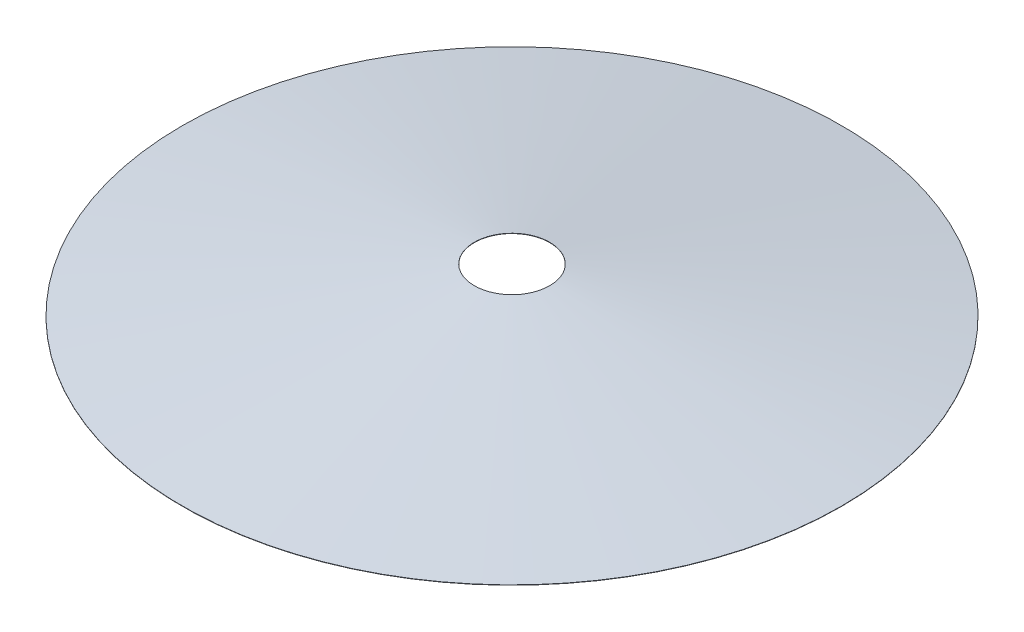
ISO-10303-21;
HEADER;
FILE_DESCRIPTION(('STEP AP214'),'2;1');
FILE_NAME('part.step','',(''),(''),'','','');
FILE_SCHEMA(('AUTOMOTIVE_DESIGN { 1 0 10303 214 1 1 1 1 }'));
ENDSEC;
DATA;
#1=APPLICATION_CONTEXT('core data for automotive mechanical design processes');
#2=APPLICATION_PROTOCOL_DEFINITION('international standard','automotive_design',2000,#1);
#3=PRODUCT_CONTEXT('',#1,'mechanical');
#4=PRODUCT('Part','Part','',(#3));
#5=PRODUCT_RELATED_PRODUCT_CATEGORY('part','',(#4));
#6=PRODUCT_DEFINITION_FORMATION('','',#4);
#7=PRODUCT_DEFINITION_CONTEXT('part definition',#1,'design');
#8=PRODUCT_DEFINITION('design','',#6,#7);
#9=PRODUCT_DEFINITION_SHAPE('','',#8);
#10=(LENGTH_UNIT() NAMED_UNIT(*) SI_UNIT(.MILLI.,.METRE.));
#11=(NAMED_UNIT(*) PLANE_ANGLE_UNIT() SI_UNIT($,.RADIAN.));
#12=(NAMED_UNIT(*) SI_UNIT($,.STERADIAN.) SOLID_ANGLE_UNIT());
#13=UNCERTAINTY_MEASURE_WITH_UNIT(LENGTH_MEASURE(1.E-05),#10,'distance_accuracy_value','');
#14=(GEOMETRIC_REPRESENTATION_CONTEXT(3) GLOBAL_UNCERTAINTY_ASSIGNED_CONTEXT((#13)) GLOBAL_UNIT_ASSIGNED_CONTEXT((#10,
#11,#12)) REPRESENTATION_CONTEXT('',''));
#15=CARTESIAN_POINT('',(0.,0.,0.));
#16=DIRECTION('',(0.,0.,1.));
#17=DIRECTION('',(1.,0.,0.));
#18=AXIS2_PLACEMENT_3D('',#15,#16,#17);
#19=CARTESIAN_POINT('',(0.,800.,0.));
#20=DIRECTION('',(0.,-1.,0.));
#21=DIRECTION('',(1.,0.,0.));
#22=AXIS2_PLACEMENT_3D('',#19,#20,#21);
#23=CONICAL_SURFACE('',#22,500.,1.41814699839963);
#24=CARTESIAN_POINT('',(0.,204.,0.));
#25=DIRECTION('',(0.,1.,0.));
#26=DIRECTION('',(-1.,0.,0.));
#27=AXIS2_PLACEMENT_3D('',#24,#25,#26);
#28=CIRCLE('',#27,4374.);
#29=CARTESIAN_POINT('',(4374.,204.,0.));
#30=VERTEX_POINT('',#29);
#31=EDGE_CURVE('E10',#30,#30,#28,.T.);
#32=CARTESIAN_POINT('',(0.,800.,0.));
#33=DIRECTION('',(0.,1.,0.));
#34=DIRECTION('',(-1.,0.,0.));
#35=AXIS2_PLACEMENT_3D('',#32,#33,#34);
#36=CIRCLE('',#35,500.);
#37=CARTESIAN_POINT('',(500.,800.,0.));
#38=VERTEX_POINT('',#37);
#39=EDGE_CURVE('E51',#38,#38,#36,.T.);
#40=CARTESIAN_POINT('',(4374.,204.,0.));
#41=CARTESIAN_POINT('',(4333.64583333333,210.208333333334,0.));
#42=CARTESIAN_POINT('',(4293.29166666667,216.416666666667,0.));
#43=CARTESIAN_POINT('',(4212.58333333333,228.833333333334,0.));
#44=CARTESIAN_POINT('',(4172.22916666667,235.041666666667,0.));
#45=CARTESIAN_POINT('',(4091.52083333333,247.458333333334,0.));
#46=CARTESIAN_POINT('',(4051.16666666667,253.666666666667,0.));
#47=CARTESIAN_POINT('',(3970.45833333333,266.083333333334,0.));
#48=CARTESIAN_POINT('',(3930.10416666667,272.291666666667,0.));
#49=CARTESIAN_POINT('',(3849.39583333333,284.708333333334,0.));
#50=CARTESIAN_POINT('',(3809.04166666667,290.916666666667,0.));
#51=CARTESIAN_POINT('',(3728.33333333333,303.333333333334,0.));
#52=CARTESIAN_POINT('',(3687.97916666667,309.541666666667,0.));
#53=CARTESIAN_POINT('',(3607.27083333333,321.958333333334,0.));
#54=CARTESIAN_POINT('',(3566.91666666667,328.166666666667,0.));
#55=CARTESIAN_POINT('',(3486.20833333333,340.583333333334,0.));
#56=CARTESIAN_POINT('',(3445.85416666667,346.791666666667,0.));
#57=CARTESIAN_POINT('',(3365.14583333333,359.208333333334,0.));
#58=CARTESIAN_POINT('',(3324.79166666667,365.416666666667,0.));
#59=CARTESIAN_POINT('',(3244.08333333333,377.833333333334,0.));
#60=CARTESIAN_POINT('',(3203.72916666667,384.041666666667,0.));
#61=CARTESIAN_POINT('',(3123.02083333333,396.458333333334,0.));
#62=CARTESIAN_POINT('',(3082.66666666667,402.666666666667,0.));
#63=CARTESIAN_POINT('',(3001.95833333333,415.083333333334,0.));
#64=CARTESIAN_POINT('',(2961.60416666667,421.291666666667,0.));
#65=CARTESIAN_POINT('',(2880.89583333333,433.708333333334,0.));
#66=CARTESIAN_POINT('',(2840.54166666667,439.916666666667,0.));
#67=CARTESIAN_POINT('',(2759.83333333333,452.333333333334,0.));
#68=CARTESIAN_POINT('',(2719.47916666667,458.541666666667,0.));
#69=CARTESIAN_POINT('',(2638.77083333333,470.958333333334,0.));
#70=CARTESIAN_POINT('',(2598.41666666667,477.166666666667,0.));
#71=CARTESIAN_POINT('',(2517.70833333333,489.583333333334,0.));
#72=CARTESIAN_POINT('',(2477.35416666667,495.791666666667,0.));
#73=CARTESIAN_POINT('',(2396.64583333333,508.208333333334,0.));
#74=CARTESIAN_POINT('',(2356.29166666667,514.416666666667,0.));
#75=CARTESIAN_POINT('',(2275.58333333333,526.833333333334,0.));
#76=CARTESIAN_POINT('',(2235.22916666667,533.041666666667,0.));
#77=CARTESIAN_POINT('',(2154.52083333333,545.458333333333,0.));
#78=CARTESIAN_POINT('',(2114.16666666667,551.666666666667,0.));
#79=CARTESIAN_POINT('',(2033.45833333333,564.083333333333,0.));
#80=CARTESIAN_POINT('',(1993.10416666667,570.291666666667,0.));
#81=CARTESIAN_POINT('',(1912.39583333333,582.708333333334,0.));
#82=CARTESIAN_POINT('',(1872.04166666667,588.916666666667,0.));
#83=CARTESIAN_POINT('',(1791.33333333333,601.333333333333,0.));
#84=CARTESIAN_POINT('',(1750.97916666667,607.541666666667,0.));
#85=CARTESIAN_POINT('',(1670.27083333333,619.958333333333,0.));
#86=CARTESIAN_POINT('',(1629.91666666667,626.166666666667,0.));
#87=CARTESIAN_POINT('',(1549.20833333333,638.583333333333,0.));
#88=CARTESIAN_POINT('',(1508.85416666667,644.791666666667,0.));
#89=CARTESIAN_POINT('',(1428.14583333333,657.208333333333,0.));
#90=CARTESIAN_POINT('',(1387.79166666667,663.416666666667,0.));
#91=CARTESIAN_POINT('',(1307.08333333333,675.833333333333,0.));
#92=CARTESIAN_POINT('',(1266.72916666667,682.041666666667,0.));
#93=CARTESIAN_POINT('',(1186.02083333333,694.458333333333,0.));
#94=CARTESIAN_POINT('',(1145.66666666667,700.666666666667,0.));
#95=CARTESIAN_POINT('',(1064.95833333333,713.083333333333,0.));
#96=CARTESIAN_POINT('',(1024.60416666667,719.291666666667,0.));
#97=CARTESIAN_POINT('',(943.895833333334,731.708333333333,0.));
#98=CARTESIAN_POINT('',(903.541666666667,737.916666666667,0.));
#99=CARTESIAN_POINT('',(822.833333333333,750.333333333333,0.));
#100=CARTESIAN_POINT('',(782.479166666667,756.541666666667,0.));
#101=CARTESIAN_POINT('',(701.770833333333,768.958333333333,0.));
#102=CARTESIAN_POINT('',(661.416666666667,775.166666666667,0.));
#103=CARTESIAN_POINT('',(580.708333333333,787.583333333333,0.));
#104=CARTESIAN_POINT('',(540.354166666667,793.791666666667,0.));
#105=CARTESIAN_POINT('',(500.,800.,0.));
#106=B_SPLINE_CURVE_WITH_KNOTS('',3,(#40,#41,#42,#43,#44,#45,#46,#47,#48,#49,#50,#51,#52,#53,
#54,#55,#56,#57,#58,#59,#60,#61,#62,#63,#64,#65,#66,#67,#68,#69,#70,#71,#72,#73,#74,#75,#76,#77,
#78,#79,#80,#81,#82,#83,#84,#85,#86,#87,#88,#89,#90,#91,#92,#93,#94,#95,#96,#97,#98,#99,#100,
#101,#102,#103,#104,#105),.UNSPECIFIED.,.F.,.F.,(4,2,2,2,2,2,2,2,2,2,2,2,2,2,2,2,2,2,2,2,2,2,2,
2,2,2,2,2,2,2,2,2,4),(0.,122.486813703557,244.973627407116,367.460441110672,489.94725481423,
612.434068517787,734.920882221344,857.407695924902,979.894509628459,1102.38132333202,
1224.86813703557,1347.35495073913,1469.84176444269,1592.32857814625,1714.8153918498,
1837.30220555336,1959.78901925692,2082.27583296048,2204.76264666403,2327.24946036759,
2449.73627407115,2572.22308777471,2694.70990147826,2817.19671518182,2939.68352888538,
3062.17034258894,3184.6571562925,3307.14396999605,3429.63078369961,3552.11759740317,
3674.60441110672,3797.09122481028,3919.57803851384),.UNSPECIFIED.);
#107=EDGE_CURVE('BSEAM37',#30,#38,#106,.T.);
#108=ORIENTED_EDGE('',*,*,#31,.T.);
#109=ORIENTED_EDGE('',*,*,#39,.F.);
#110=ORIENTED_EDGE('',*,*,#107,.T.);
#111=ORIENTED_EDGE('',*,*,#107,.F.);
#112=EDGE_LOOP('',(#108,#110,#109,#111));
#113=FACE_BOUND('',#112,.T.);
#114=ADVANCED_FACE('F37',(#113),#23,.T.);
#115=CARTESIAN_POINT('',(0.,796.,0.));
#116=DIRECTION('',(0.,1.,0.));
#117=DIRECTION('',(-1.,0.,0.));
#118=AXIS2_PLACEMENT_3D('',#115,#116,#117);
#119=CYLINDRICAL_SURFACE('',#118,4374.);
#120=CARTESIAN_POINT('',(0.,200.,0.));
#121=DIRECTION('',(0.,1.,0.));
#122=DIRECTION('',(-1.,0.,0.));
#123=AXIS2_PLACEMENT_3D('',#120,#121,#122);
#124=CIRCLE('',#123,4374.);
#125=CARTESIAN_POINT('',(4374.,200.,0.));
#126=VERTEX_POINT('',#125);
#127=EDGE_CURVE('E43',#126,#126,#124,.T.);
#128=ORIENTED_EDGE('',*,*,#127,.T.);
#129=EDGE_LOOP('',(#128));
#130=FACE_BOUND('',#129,.T.);
#131=ORIENTED_EDGE('',*,*,#31,.F.);
#132=EDGE_LOOP('',(#131));
#133=FACE_BOUND('',#132,.T.);
#134=ADVANCED_FACE('F60',(#130,#133),#119,.T.);
#135=CARTESIAN_POINT('',(0.,200.,0.));
#136=DIRECTION('',(0.,-1.,0.));
#137=DIRECTION('',(1.,0.,0.));
#138=AXIS2_PLACEMENT_3D('',#135,#136,#137);
#139=CONICAL_SURFACE('',#138,4374.,1.41814699839963);
#140=CARTESIAN_POINT('',(0.,796.,0.));
#141=DIRECTION('',(0.,-1.,0.));
#142=DIRECTION('',(1.,0.,0.));
#143=AXIS2_PLACEMENT_3D('',#140,#141,#142);
#144=CIRCLE('',#143,500.);
#145=CARTESIAN_POINT('',(499.999999999998,796.,0.));
#146=VERTEX_POINT('',#145);
#147=EDGE_CURVE('E47',#146,#146,#144,.T.);
#148=CARTESIAN_POINT('',(499.999999999998,796.,0.));
#149=CARTESIAN_POINT('',(540.354166666665,789.791666666667,0.));
#150=CARTESIAN_POINT('',(580.708333333331,783.583333333333,0.));
#151=CARTESIAN_POINT('',(661.416666666665,771.166666666667,0.));
#152=CARTESIAN_POINT('',(701.770833333331,764.958333333333,0.));
#153=CARTESIAN_POINT('',(782.479166666665,752.541666666667,0.));
#154=CARTESIAN_POINT('',(822.833333333331,746.333333333333,0.));
#155=CARTESIAN_POINT('',(903.541666666665,733.916666666667,0.));
#156=CARTESIAN_POINT('',(943.895833333331,727.708333333333,0.));
#157=CARTESIAN_POINT('',(1024.60416666666,715.291666666667,0.));
#158=CARTESIAN_POINT('',(1064.95833333333,709.083333333333,0.));
#159=CARTESIAN_POINT('',(1145.66666666667,696.666666666667,0.));
#160=CARTESIAN_POINT('',(1186.02083333333,690.458333333333,0.));
#161=CARTESIAN_POINT('',(1266.72916666666,678.041666666667,0.));
#162=CARTESIAN_POINT('',(1307.08333333333,671.833333333333,0.));
#163=CARTESIAN_POINT('',(1387.79166666667,659.416666666667,0.));
#164=CARTESIAN_POINT('',(1428.14583333333,653.208333333333,0.));
#165=CARTESIAN_POINT('',(1508.85416666667,640.791666666667,0.));
#166=CARTESIAN_POINT('',(1549.20833333333,634.583333333333,0.));
#167=CARTESIAN_POINT('',(1629.91666666667,622.166666666667,0.));
#168=CARTESIAN_POINT('',(1670.27083333333,615.958333333333,0.));
#169=CARTESIAN_POINT('',(1750.97916666667,603.541666666667,0.));
#170=CARTESIAN_POINT('',(1791.33333333333,597.333333333333,0.));
#171=CARTESIAN_POINT('',(1872.04166666667,584.916666666667,0.));
#172=CARTESIAN_POINT('',(1912.39583333333,578.708333333333,0.));
#173=CARTESIAN_POINT('',(1993.10416666667,566.291666666667,0.));
#174=CARTESIAN_POINT('',(2033.45833333333,560.083333333333,0.));
#175=CARTESIAN_POINT('',(2114.16666666667,547.666666666667,0.));
#176=CARTESIAN_POINT('',(2154.52083333333,541.458333333333,0.));
#177=CARTESIAN_POINT('',(2235.22916666667,529.041666666667,0.));
#178=CARTESIAN_POINT('',(2275.58333333333,522.833333333333,0.));
#179=CARTESIAN_POINT('',(2356.29166666667,510.416666666667,0.));
#180=CARTESIAN_POINT('',(2396.64583333333,504.208333333333,0.));
#181=CARTESIAN_POINT('',(2477.35416666667,491.791666666667,0.));
#182=CARTESIAN_POINT('',(2517.70833333333,485.583333333333,0.));
#183=CARTESIAN_POINT('',(2598.41666666667,473.166666666667,0.));
#184=CARTESIAN_POINT('',(2638.77083333333,466.958333333333,0.));
#185=CARTESIAN_POINT('',(2719.47916666667,454.541666666667,0.));
#186=CARTESIAN_POINT('',(2759.83333333333,448.333333333333,0.));
#187=CARTESIAN_POINT('',(2840.54166666667,435.916666666667,0.));
#188=CARTESIAN_POINT('',(2880.89583333333,429.708333333333,0.));
#189=CARTESIAN_POINT('',(2961.60416666667,417.291666666667,0.));
#190=CARTESIAN_POINT('',(3001.95833333333,411.083333333333,0.));
#191=CARTESIAN_POINT('',(3082.66666666667,398.666666666667,0.));
#192=CARTESIAN_POINT('',(3123.02083333333,392.458333333333,0.));
#193=CARTESIAN_POINT('',(3203.72916666667,380.041666666667,0.));
#194=CARTESIAN_POINT('',(3244.08333333333,373.833333333333,0.));
#195=CARTESIAN_POINT('',(3324.79166666667,361.416666666667,0.));
#196=CARTESIAN_POINT('',(3365.14583333333,355.208333333333,0.));
#197=CARTESIAN_POINT('',(3445.85416666667,342.791666666667,0.));
#198=CARTESIAN_POINT('',(3486.20833333333,336.583333333333,0.));
#199=CARTESIAN_POINT('',(3566.91666666667,324.166666666667,0.));
#200=CARTESIAN_POINT('',(3607.27083333333,317.958333333333,0.));
#201=CARTESIAN_POINT('',(3687.97916666667,305.541666666667,0.));
#202=CARTESIAN_POINT('',(3728.33333333333,299.333333333333,0.));
#203=CARTESIAN_POINT('',(3809.04166666667,286.916666666667,0.));
#204=CARTESIAN_POINT('',(3849.39583333333,280.708333333333,0.));
#205=CARTESIAN_POINT('',(3930.10416666667,268.291666666667,0.));
#206=CARTESIAN_POINT('',(3970.45833333333,262.083333333333,0.));
#207=CARTESIAN_POINT('',(4051.16666666667,249.666666666667,0.));
#208=CARTESIAN_POINT('',(4091.52083333333,243.458333333333,0.));
#209=CARTESIAN_POINT('',(4172.22916666667,231.041666666667,0.));
#210=CARTESIAN_POINT('',(4212.58333333333,224.833333333333,0.));
#211=CARTESIAN_POINT('',(4293.29166666667,212.416666666667,0.));
#212=CARTESIAN_POINT('',(4333.64583333333,206.208333333333,0.));
#213=CARTESIAN_POINT('',(4374.,200.,0.));
#214=B_SPLINE_CURVE_WITH_KNOTS('',3,(#148,#149,#150,#151,#152,#153,#154,#155,#156,#157,#158,
#159,#160,#161,#162,#163,#164,#165,#166,#167,#168,#169,#170,#171,#172,#173,#174,#175,#176,#177,
#178,#179,#180,#181,#182,#183,#184,#185,#186,#187,#188,#189,#190,#191,#192,#193,#194,#195,#196,
#197,#198,#199,#200,#201,#202,#203,#204,#205,#206,#207,#208,#209,#210,#211,#212,#213),
.UNSPECIFIED.,.F.,.F.,(4,2,2,2,2,2,2,2,2,2,2,2,2,2,2,2,2,2,2,2,2,2,2,2,2,2,2,2,2,2,2,2,4),(0.,
122.486813703558,244.973627407115,367.460441110673,489.94725481423,612.434068517788,
734.920882221345,857.407695924903,979.89450962846,1102.38132333202,1224.86813703558,
1347.35495073913,1469.84176444269,1592.32857814625,1714.81539184981,1837.30220555336,
1959.78901925692,2082.27583296048,2204.76264666404,2327.24946036759,2449.73627407115,
2572.22308777471,2694.70990147827,2817.19671518182,2939.68352888538,3062.17034258894,
3184.6571562925,3307.14396999605,3429.63078369961,3552.11759740317,3674.60441110673,
3797.09122481028,3919.57803851384),.UNSPECIFIED.);
#215=EDGE_CURVE('BSEAM64',#146,#126,#214,.T.);
#216=ORIENTED_EDGE('',*,*,#147,.F.);
#217=ORIENTED_EDGE('',*,*,#127,.F.);
#218=ORIENTED_EDGE('',*,*,#215,.T.);
#219=ORIENTED_EDGE('',*,*,#215,.F.);
#220=EDGE_LOOP('',(#216,#218,#217,#219));
#221=FACE_BOUND('',#220,.T.);
#222=ADVANCED_FACE('F64',(#221),#139,.F.);
#223=CARTESIAN_POINT('',(0.,200.,0.));
#224=DIRECTION('',(0.,1.,0.));
#225=DIRECTION('',(-1.,0.,0.));
#226=AXIS2_PLACEMENT_3D('',#223,#224,#225);
#227=CYLINDRICAL_SURFACE('',#226,500.);
#228=ORIENTED_EDGE('',*,*,#147,.T.);
#229=EDGE_LOOP('',(#228));
#230=FACE_BOUND('',#229,.T.);
#231=ORIENTED_EDGE('',*,*,#39,.T.);
#232=EDGE_LOOP('',(#231));
#233=FACE_BOUND('',#232,.T.);
#234=ADVANCED_FACE('F57',(#230,#233),#227,.F.);
#235=CLOSED_SHELL('',(#114,#134,#222,#234));
#236=MANIFOLD_SOLID_BREP('B2',#235);
#237=ADVANCED_BREP_SHAPE_REPRESENTATION('',(#18,#236),#14);
#238=SHAPE_DEFINITION_REPRESENTATION(#9,#237);
ENDSEC;
END-ISO-10303-21;
